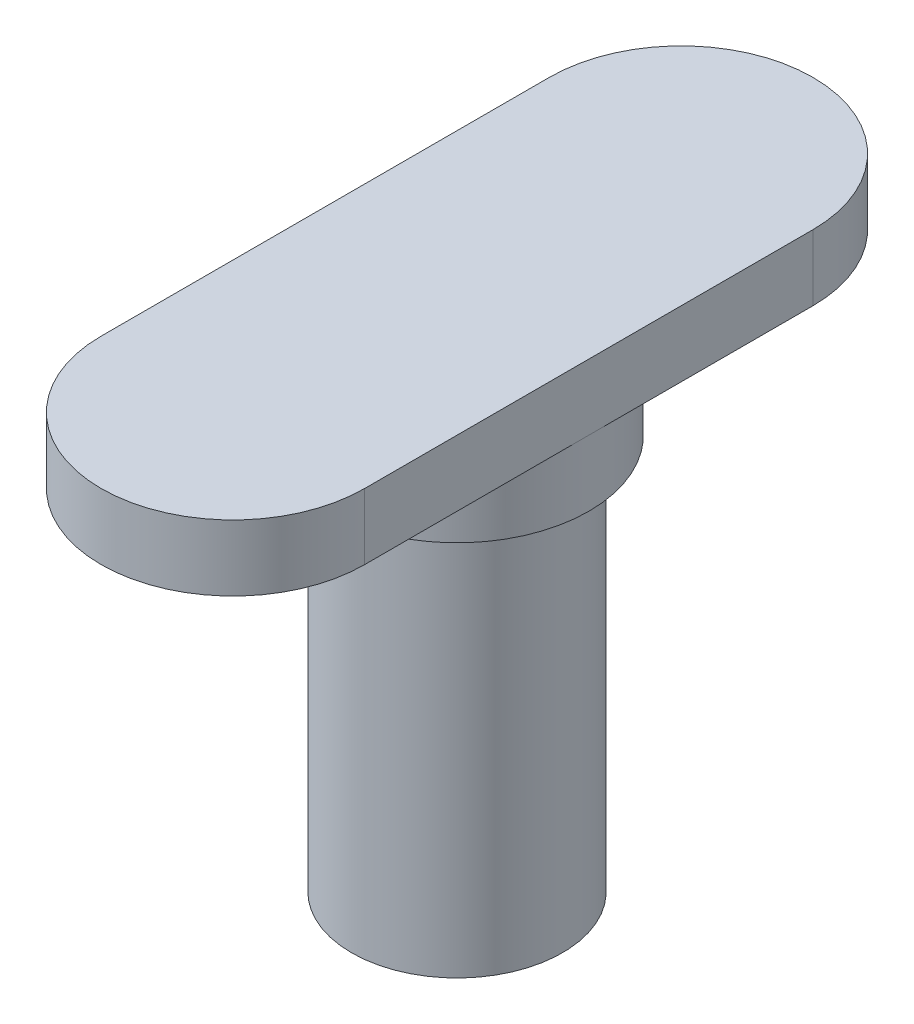
ISO-10303-21;
HEADER;
FILE_DESCRIPTION(('STEP AP214'),'2;1');
FILE_NAME('part.step','',(''),(''),'','','');
FILE_SCHEMA(('AUTOMOTIVE_DESIGN { 1 0 10303 214 1 1 1 1 }'));
ENDSEC;
DATA;
#1=APPLICATION_CONTEXT('core data for automotive mechanical design processes');
#2=APPLICATION_PROTOCOL_DEFINITION('international standard','automotive_design',2000,#1);
#3=PRODUCT_CONTEXT('',#1,'mechanical');
#4=PRODUCT('Part','Part','',(#3));
#5=PRODUCT_RELATED_PRODUCT_CATEGORY('part','',(#4));
#6=PRODUCT_DEFINITION_FORMATION('','',#4);
#7=PRODUCT_DEFINITION_CONTEXT('part definition',#1,'design');
#8=PRODUCT_DEFINITION('design','',#6,#7);
#9=PRODUCT_DEFINITION_SHAPE('','',#8);
#10=(LENGTH_UNIT() NAMED_UNIT(*) SI_UNIT(.MILLI.,.METRE.));
#11=(NAMED_UNIT(*) PLANE_ANGLE_UNIT() SI_UNIT($,.RADIAN.));
#12=(NAMED_UNIT(*) SI_UNIT($,.STERADIAN.) SOLID_ANGLE_UNIT());
#13=UNCERTAINTY_MEASURE_WITH_UNIT(LENGTH_MEASURE(1.E-05),#10,'distance_accuracy_value','');
#14=(GEOMETRIC_REPRESENTATION_CONTEXT(3) GLOBAL_UNCERTAINTY_ASSIGNED_CONTEXT((#13)) GLOBAL_UNIT_ASSIGNED_CONTEXT((#10,
#11,#12)) REPRESENTATION_CONTEXT('',''));
#15=CARTESIAN_POINT('',(0.,0.,0.));
#16=DIRECTION('',(0.,0.,1.));
#17=DIRECTION('',(1.,0.,0.));
#18=AXIS2_PLACEMENT_3D('',#15,#16,#17);
#19=CARTESIAN_POINT('',(0.,20.,0.));
#20=DIRECTION('',(0.,-1.,0.));
#21=DIRECTION('',(0.,0.,-1.));
#22=AXIS2_PLACEMENT_3D('',#19,#20,#21);
#23=CYLINDRICAL_SURFACE('',#22,5.);
#24=CARTESIAN_POINT('',(0.,15.,0.));
#25=DIRECTION('',(0.,1.,0.));
#26=DIRECTION('',(0.,0.,1.));
#27=AXIS2_PLACEMENT_3D('',#24,#25,#26);
#28=CIRCLE('',#27,5.);
#29=CARTESIAN_POINT('',(0.,15.,5.));
#30=VERTEX_POINT('',#29);
#31=EDGE_CURVE('E142',#30,#30,#28,.T.);
#32=ORIENTED_EDGE('',*,*,#31,.T.);
#33=EDGE_LOOP('',(#32));
#34=FACE_BOUND('',#33,.T.);
#35=CARTESIAN_POINT('',(0.,17.5,0.));
#36=DIRECTION('',(0.,1.,0.));
#37=DIRECTION('',(0.,0.,1.));
#38=AXIS2_PLACEMENT_3D('',#35,#36,#37);
#39=CIRCLE('',#38,5.);
#40=CARTESIAN_POINT('',(5.,17.5,0.));
#41=VERTEX_POINT('',#40);
#42=CARTESIAN_POINT('',(-5.,17.5,0.));
#43=VERTEX_POINT('',#42);
#44=EDGE_CURVE('E11',#41,#43,#39,.T.);
#45=ORIENTED_EDGE('',*,*,#44,.F.);
#46=EDGE_CURVE('E47',#43,#41,#39,.T.);
#47=ORIENTED_EDGE('',*,*,#46,.F.);
#48=EDGE_LOOP('',(#45,#47));
#49=FACE_BOUND('',#48,.T.);
#50=ADVANCED_FACE('F37',(#34,#49),#23,.T.);
#51=CARTESIAN_POINT('',(0.,15.,0.));
#52=DIRECTION('',(0.,-1.,0.));
#53=DIRECTION('',(0.,0.,-1.));
#54=AXIS2_PLACEMENT_3D('',#51,#52,#53);
#55=CYLINDRICAL_SURFACE('',#54,4.);
#56=CARTESIAN_POINT('',(-3.70809924354783,5.,-1.5));
#57=CARTESIAN_POINT('',(-3.70809640633806,5.08100748372079,-1.50000304106109));
#58=CARTESIAN_POINT('',(-3.71078260240986,5.16199492250364,-1.49341597549487));
#59=CARTESIAN_POINT('',(-3.72116159304967,5.3215280829132,-1.46736187895468));
#60=CARTESIAN_POINT('',(-3.72885423767112,5.40007387759501,-1.44789523373263));
#61=CARTESIAN_POINT('',(-3.748254802809,5.55237537161353,-1.39689657610574));
#62=CARTESIAN_POINT('',(-3.7599530956926,5.62614205665108,-1.36539347266348));
#63=CARTESIAN_POINT('',(-3.78603134206598,5.76737189681884,-1.29131856742698));
#64=CARTESIAN_POINT('',(-3.80041210067323,5.83483315028252,-1.24874344095039));
#65=CARTESIAN_POINT('',(-3.83103574665713,5.96489031162282,-1.15146661374162));
#66=CARTESIAN_POINT('',(-3.84733341923603,6.02712852962939,-1.09630381213306));
#67=CARTESIAN_POINT('',(-3.87949750628547,6.14172281467149,-0.976395839778925));
#68=CARTESIAN_POINT('',(-3.89536382814785,6.19407677374186,-0.911648630256679));
#69=CARTESIAN_POINT('',(-3.92552873936553,6.28913951229561,-0.7716946551776));
#70=CARTESIAN_POINT('',(-3.93975561223505,6.33145947471586,-0.696206947538027));
#71=CARTESIAN_POINT('',(-3.96438007973847,6.40265117252491,-0.538555771965246));
#72=CARTESIAN_POINT('',(-3.97477900217006,6.43152757199197,-0.456394630933535));
#73=CARTESIAN_POINT('',(-3.99018697103439,6.47375789577462,-0.291489341676831));
#74=CARTESIAN_POINT('',(-3.99540915214774,6.48772762744046,-0.208923197281595));
#75=CARTESIAN_POINT('',(-4.0006401410794,6.50172120094499,-0.0424643637947848));
#76=CARTESIAN_POINT('',(-4.00065064414902,6.50174957761871,0.0414278850628343));
#77=CARTESIAN_POINT('',(-3.99559265903894,6.48821823853483,0.203743543064477));
#78=CARTESIAN_POINT('',(-3.99077541996683,6.47533070205118,0.282232178266901));
#79=CARTESIAN_POINT('',(-3.97693274932263,6.43746408477445,0.435839217984392));
#80=CARTESIAN_POINT('',(-3.96790701975577,6.41248414773796,0.510957383430299));
#81=CARTESIAN_POINT('',(-3.9463776916753,6.35082954832415,0.656989017303105));
#82=CARTESIAN_POINT('',(-3.93382539470077,6.31398999473159,0.72782539228731));
#83=CARTESIAN_POINT('',(-3.90651310225279,6.22980790307061,0.86248660795756));
#84=CARTESIAN_POINT('',(-3.8917523951284,6.1824619769824,0.926309176932324));
#85=CARTESIAN_POINT('',(-3.86052529655816,6.07537271371681,1.04909048680094));
#86=CARTESIAN_POINT('',(-3.84400963763882,6.01506608434957,1.10754614526348));
#87=CARTESIAN_POINT('',(-3.81182460645722,5.88540700667844,1.21370395569343));
#88=CARTESIAN_POINT('',(-3.79615544748847,5.81605229341336,1.261403406929));
#89=CARTESIAN_POINT('',(-3.76712703500335,5.66828053253718,1.34565611808152));
#90=CARTESIAN_POINT('',(-3.75382677150277,5.58969650631393,1.38193847851831));
#91=CARTESIAN_POINT('',(-3.73172438629002,5.42690377483243,1.44056464441501));
#92=CARTESIAN_POINT('',(-3.72291976205783,5.34269822840631,1.46291620605595));
#93=CARTESIAN_POINT('',(-3.71139597222848,5.17602403768405,1.49190191709668));
#94=CARTESIAN_POINT('',(-3.70836785241537,5.09371589446386,1.49933521158966));
#95=CARTESIAN_POINT('',(-3.70786539525016,4.92899064325826,1.50057885636272));
#96=CARTESIAN_POINT('',(-3.71038967003987,4.84657356764753,1.49439261093762));
#97=CARTESIAN_POINT('',(-3.72039381629735,4.68807007771232,1.46929733520157));
#98=CARTESIAN_POINT('',(-3.72763276216449,4.61186886423534,1.45100618334224));
#99=CARTESIAN_POINT('',(-3.74596487046362,4.46365205527981,1.40299774640637));
#100=CARTESIAN_POINT('',(-3.75705882250173,4.39163732083186,1.37327812034623));
#101=CARTESIAN_POINT('',(-3.7823624311608,4.25083556192379,1.30200292275278));
#102=CARTESIAN_POINT('',(-3.79667328892065,4.18227070786266,1.26004545177047));
#103=CARTESIAN_POINT('',(-3.82662814294291,4.05287101827396,1.16591317862479));
#104=CARTESIAN_POINT('',(-3.84227262594077,3.99203902537537,1.11373463696435));
#105=CARTESIAN_POINT('',(-3.87433046553184,3.8758316268049,0.996727340900937));
#106=CARTESIAN_POINT('',(-3.89072969357027,3.82104659123125,0.93130634149106));
#107=CARTESIAN_POINT('',(-3.92149874963302,3.72316163241056,0.791797471753149));
#108=CARTESIAN_POINT('',(-3.93586857107664,3.68006174705416,0.717709573322672));
#109=CARTESIAN_POINT('',(-3.96094985704552,3.60705394380039,0.563016329468476));
#110=CARTESIAN_POINT('',(-3.9716738133801,3.5771008762074,0.482434433064626));
#111=CARTESIAN_POINT('',(-3.98829436712571,3.53134358615008,0.316881887523254));
#112=CARTESIAN_POINT('',(-3.99419323299412,3.5155327145776,0.231913320723592));
#113=CARTESIAN_POINT('',(-4.00028407317073,3.49922559724517,0.0653355852738149));
#114=CARTESIAN_POINT('',(-4.00078860953764,3.49789051694101,-0.0161807680608458));
#115=CARTESIAN_POINT('',(-3.99684889809223,3.50841515944539,-0.178226786412424));
#116=CARTESIAN_POINT('',(-3.9924052471313,3.52027329088586,-0.258756569245258));
#117=CARTESIAN_POINT('',(-3.97921089603771,3.55625885149362,-0.414548248377127));
#118=CARTESIAN_POINT('',(-3.97056791378017,3.58007990587836,-0.489890731068835));
#119=CARTESIAN_POINT('',(-3.9498778362099,3.63901001338436,-0.63551547300639));
#120=CARTESIAN_POINT('',(-3.93783009655664,3.67412120330475,-0.705796771275543));
#121=CARTESIAN_POINT('',(-3.91090618300074,3.75631394350481,-0.842540176994413));
#122=CARTESIAN_POINT('',(-3.89593240108828,3.80383664051415,-0.90871754884685));
#123=CARTESIAN_POINT('',(-3.86499507694844,3.90880783018761,-1.03241734752336));
#124=CARTESIAN_POINT('',(-3.84903118274027,3.96625986580787,-1.0899366712559));
#125=CARTESIAN_POINT('',(-3.81688129739175,4.09306413164506,-1.19781214236196));
#126=CARTESIAN_POINT('',(-3.8007280534916,4.16288440215431,-1.24762999816025));
#127=CARTESIAN_POINT('',(-3.77098325003638,4.31041586957333,-1.33484709556843));
#128=CARTESIAN_POINT('',(-3.75739195631216,4.38812788405348,-1.37224504878157));
#129=CARTESIAN_POINT('',(-3.73402269853266,4.55295568097541,-1.4346588697426));
#130=CARTESIAN_POINT('',(-3.7244380329086,4.64033436651178,-1.45906002899523));
#131=CARTESIAN_POINT('',(-3.71147994336315,4.81848527195579,-1.49172356722079));
#132=CARTESIAN_POINT('',(-3.70810242179736,4.90925521270999,-1.49999659339571));
#133=CARTESIAN_POINT('',(-3.70809924354783,5.,-1.5));
#134=B_SPLINE_CURVE_WITH_KNOTS('',3,(#56,#57,#58,#59,#60,#61,#62,#63,#64,#65,#66,#67,#68,#69,
#70,#71,#72,#73,#74,#75,#76,#77,#78,#79,#80,#81,#82,#83,#84,#85,#86,#87,#88,#89,#90,#91,#92,#93,
#94,#95,#96,#97,#98,#99,#100,#101,#102,#103,#104,#105,#106,#107,#108,#109,#110,#111,#112,#113,
#114,#115,#116,#117,#118,#119,#120,#121,#122,#123,#124,#125,#126,#127,#128,#129,#130,#131,#132,
#133),.UNSPECIFIED.,.T.,.F.,(4,2,2,2,2,2,2,2,2,2,2,2,2,2,2,2,2,2,2,2,2,2,2,2,2,2,2,2,2,2,2,2,2,
2,2,2,2,2,4),(0.,0.24268454141617,0.485361814598855,0.72745985675703,0.969630679682934,
1.22274652401128,1.47591628822983,1.73770072136421,1.9993942638133,2.24980018489679,
2.50012465404857,2.73806472803194,2.97602165263335,3.21744131210668,3.45893893628976,
3.71456675065875,3.97025867827335,4.23162592252966,4.49284751635474,4.73965657740485,
4.98640395388884,5.22143845928199,5.45652113429526,5.70041561005821,5.94439948466355,
6.20385016993624,6.46330169650178,6.72185508890168,6.98028685560127,7.22365720549936,
7.4669982031948,7.7044027400389,7.94185223512831,8.18928323676987,8.43680270894964,
8.69738599542079,8.95799630544242,9.23003178870926,9.50188762323053),.UNSPECIFIED.);
#135=CARTESIAN_POINT('',(-3.70809924354783,5.,-1.5));
#136=VERTEX_POINT('',#135);
#137=EDGE_CURVE('E212',#136,#136,#134,.T.);
#138=ORIENTED_EDGE('',*,*,#137,.T.);
#139=EDGE_LOOP('',(#138));
#140=FACE_BOUND('',#139,.T.);
#141=CARTESIAN_POINT('',(0.,15.,0.));
#142=DIRECTION('',(0.,1.,0.));
#143=DIRECTION('',(0.,0.,1.));
#144=AXIS2_PLACEMENT_3D('',#141,#142,#143);
#145=CIRCLE('',#144,4.);
#146=CARTESIAN_POINT('',(0.,15.,4.));
#147=VERTEX_POINT('',#146);
#148=EDGE_CURVE('E153',#147,#147,#145,.T.);
#149=ORIENTED_EDGE('',*,*,#148,.F.);
#150=EDGE_LOOP('',(#149));
#151=FACE_BOUND('',#150,.T.);
#152=CARTESIAN_POINT('',(0.,0.,0.));
#153=DIRECTION('',(0.,1.,0.));
#154=DIRECTION('',(0.,0.,1.));
#155=AXIS2_PLACEMENT_3D('',#152,#153,#154);
#156=CIRCLE('',#155,4.);
#157=CARTESIAN_POINT('',(0.,0.,4.));
#158=VERTEX_POINT('',#157);
#159=EDGE_CURVE('E152',#158,#158,#156,.T.);
#160=ORIENTED_EDGE('',*,*,#159,.T.);
#161=EDGE_LOOP('',(#160));
#162=FACE_BOUND('',#161,.T.);
#163=ADVANCED_FACE('F39',(#140,#151,#162),#55,.T.);
#164=CARTESIAN_POINT('',(0.,0.,0.));
#165=DIRECTION('',(0.,1.,0.));
#166=DIRECTION('',(0.,0.,1.));
#167=AXIS2_PLACEMENT_3D('',#164,#165,#166);
#168=PLANE('',#167);
#169=DIRECTION('',(0.,0.,1.));
#170=VECTOR('',#169,1.);
#171=CARTESIAN_POINT('',(-1.,0.,0.));
#172=LINE('',#171,#170);
#173=CARTESIAN_POINT('',(-1.,0.,-1.73205080756888));
#174=VERTEX_POINT('',#173);
#175=CARTESIAN_POINT('',(-1.,0.,1.73205080756888));
#176=VERTEX_POINT('',#175);
#177=EDGE_CURVE('E54',#174,#176,#172,.T.);
#178=ORIENTED_EDGE('',*,*,#177,.T.);
#179=CARTESIAN_POINT('',(0.,0.,0.));
#180=DIRECTION('',(0.,1.,0.));
#181=DIRECTION('',(0.,0.,1.));
#182=AXIS2_PLACEMENT_3D('',#179,#180,#181);
#183=CIRCLE('',#182,2.);
#184=EDGE_CURVE('E107',#176,#174,#183,.T.);
#185=ORIENTED_EDGE('',*,*,#184,.T.);
#186=EDGE_LOOP('',(#178,#185));
#187=FACE_BOUND('',#186,.T.);
#188=ORIENTED_EDGE('',*,*,#159,.F.);
#189=EDGE_LOOP('',(#188));
#190=FACE_BOUND('',#189,.T.);
#191=ADVANCED_FACE('F198',(#187,#190),#168,.F.);
#192=CARTESIAN_POINT('',(0.,15.,0.));
#193=DIRECTION('',(0.,1.,0.));
#194=DIRECTION('',(0.,0.,1.));
#195=AXIS2_PLACEMENT_3D('',#192,#193,#194);
#196=PLANE('',#195);
#197=ORIENTED_EDGE('',*,*,#148,.T.);
#198=EDGE_LOOP('',(#197));
#199=FACE_BOUND('',#198,.T.);
#200=ORIENTED_EDGE('',*,*,#31,.F.);
#201=EDGE_LOOP('',(#200));
#202=FACE_BOUND('',#201,.T.);
#203=ADVANCED_FACE('F201',(#199,#202),#196,.F.);
#204=CARTESIAN_POINT('',(0.,17.5,-8.5));
#205=DIRECTION('',(0.,1.,0.));
#206=DIRECTION('',(0.,0.,1.));
#207=AXIS2_PLACEMENT_3D('',#204,#205,#206);
#208=PLANE('',#207);
#209=DIRECTION('',(0.,0.,1.));
#210=VECTOR('',#209,1.);
#211=CARTESIAN_POINT('',(5.,17.5,0.));
#212=LINE('',#211,#210);
#213=CARTESIAN_POINT('',(5.,17.5,-8.5));
#214=VERTEX_POINT('',#213);
#215=EDGE_CURVE('E131',#214,#41,#212,.T.);
#216=ORIENTED_EDGE('',*,*,#215,.T.);
#217=ORIENTED_EDGE('',*,*,#44,.T.);
#218=DIRECTION('',(0.,0.,1.));
#219=VECTOR('',#218,1.);
#220=CARTESIAN_POINT('',(-5.,17.5,0.));
#221=LINE('',#220,#219);
#222=CARTESIAN_POINT('',(-5.,17.5,-8.5));
#223=VERTEX_POINT('',#222);
#224=EDGE_CURVE('E124',#223,#43,#221,.T.);
#225=ORIENTED_EDGE('',*,*,#224,.F.);
#226=CARTESIAN_POINT('',(0.,17.5,-8.5));
#227=DIRECTION('',(0.,1.,0.));
#228=DIRECTION('',(0.,0.,1.));
#229=AXIS2_PLACEMENT_3D('',#226,#227,#228);
#230=CIRCLE('',#229,5.);
#231=EDGE_CURVE('E119',#214,#223,#230,.T.);
#232=ORIENTED_EDGE('',*,*,#231,.F.);
#233=EDGE_LOOP('',(#216,#217,#225,#232));
#234=FACE_BOUND('',#233,.T.);
#235=ADVANCED_FACE('F168',(#234),#208,.F.);
#236=CARTESIAN_POINT('',(5.,17.5,0.));
#237=DIRECTION('',(-1.,0.,0.));
#238=DIRECTION('',(0.,0.,1.));
#239=AXIS2_PLACEMENT_3D('',#236,#237,#238);
#240=PLANE('',#239);
#241=DIRECTION('',(0.,0.,1.));
#242=VECTOR('',#241,1.);
#243=CARTESIAN_POINT('',(5.,20.,0.));
#244=LINE('',#243,#242);
#245=CARTESIAN_POINT('',(5.,20.,-8.5));
#246=VERTEX_POINT('',#245);
#247=CARTESIAN_POINT('',(5.,20.,8.5));
#248=VERTEX_POINT('',#247);
#249=EDGE_CURVE('E123',#246,#248,#244,.T.);
#250=ORIENTED_EDGE('',*,*,#249,.T.);
#251=DIRECTION('',(0.,1.,0.));
#252=VECTOR('',#251,1.);
#253=CARTESIAN_POINT('',(5.,17.5,8.5));
#254=LINE('',#253,#252);
#255=CARTESIAN_POINT('',(5.,17.5,8.5));
#256=VERTEX_POINT('',#255);
#257=EDGE_CURVE('E143',#256,#248,#254,.T.);
#258=ORIENTED_EDGE('',*,*,#257,.F.);
#259=EDGE_CURVE('E130',#41,#256,#212,.T.);
#260=ORIENTED_EDGE('',*,*,#259,.F.);
#261=ORIENTED_EDGE('',*,*,#215,.F.);
#262=DIRECTION('',(0.,1.,0.));
#263=VECTOR('',#262,1.);
#264=CARTESIAN_POINT('',(5.,17.5,-8.5));
#265=LINE('',#264,#263);
#266=EDGE_CURVE('E140',#214,#246,#265,.T.);
#267=ORIENTED_EDGE('',*,*,#266,.T.);
#268=EDGE_LOOP('',(#250,#258,#260,#261,#267));
#269=FACE_BOUND('',#268,.T.);
#270=ADVANCED_FACE('F165',(#269),#240,.F.);
#271=CARTESIAN_POINT('',(-5.,17.5,0.));
#272=DIRECTION('',(-1.,0.,0.));
#273=DIRECTION('',(0.,0.,1.));
#274=AXIS2_PLACEMENT_3D('',#271,#272,#273);
#275=PLANE('',#274);
#276=ORIENTED_EDGE('',*,*,#224,.T.);
#277=CARTESIAN_POINT('',(-5.,17.5,8.49999999999999));
#278=VERTEX_POINT('',#277);
#279=EDGE_CURVE('E122',#43,#278,#221,.T.);
#280=ORIENTED_EDGE('',*,*,#279,.T.);
#281=DIRECTION('',(0.,1.,0.));
#282=VECTOR('',#281,1.);
#283=CARTESIAN_POINT('',(-5.,17.5,8.49999999999999));
#284=LINE('',#283,#282);
#285=CARTESIAN_POINT('',(-5.,20.,8.49999999999999));
#286=VERTEX_POINT('',#285);
#287=EDGE_CURVE('E146',#278,#286,#284,.T.);
#288=ORIENTED_EDGE('',*,*,#287,.T.);
#289=DIRECTION('',(0.,0.,1.));
#290=VECTOR('',#289,1.);
#291=CARTESIAN_POINT('',(-5.,20.,0.));
#292=LINE('',#291,#290);
#293=CARTESIAN_POINT('',(-5.,20.,-8.5));
#294=VERTEX_POINT('',#293);
#295=EDGE_CURVE('E114',#294,#286,#292,.T.);
#296=ORIENTED_EDGE('',*,*,#295,.F.);
#297=DIRECTION('',(0.,1.,0.));
#298=VECTOR('',#297,1.);
#299=CARTESIAN_POINT('',(-5.,17.5,-8.5));
#300=LINE('',#299,#298);
#301=EDGE_CURVE('E133',#223,#294,#300,.T.);
#302=ORIENTED_EDGE('',*,*,#301,.F.);
#303=EDGE_LOOP('',(#276,#280,#288,#296,#302));
#304=FACE_BOUND('',#303,.T.);
#305=ADVANCED_FACE('F182',(#304),#275,.T.);
#306=CARTESIAN_POINT('',(0.,17.5,-8.5));
#307=DIRECTION('',(0.,1.,0.));
#308=DIRECTION('',(0.,0.,1.));
#309=AXIS2_PLACEMENT_3D('',#306,#307,#308);
#310=CYLINDRICAL_SURFACE('',#309,5.);
#311=CARTESIAN_POINT('',(0.,20.,-8.5));
#312=DIRECTION('',(0.,1.,0.));
#313=DIRECTION('',(0.,0.,1.));
#314=AXIS2_PLACEMENT_3D('',#311,#312,#313);
#315=CIRCLE('',#314,5.);
#316=EDGE_CURVE('E111',#246,#294,#315,.T.);
#317=ORIENTED_EDGE('',*,*,#316,.F.);
#318=ORIENTED_EDGE('',*,*,#266,.F.);
#319=ORIENTED_EDGE('',*,*,#231,.T.);
#320=ORIENTED_EDGE('',*,*,#301,.T.);
#321=EDGE_LOOP('',(#317,#318,#319,#320));
#322=FACE_BOUND('',#321,.T.);
#323=ADVANCED_FACE('F172',(#322),#310,.T.);
#324=CARTESIAN_POINT('',(0.,17.5,8.5));
#325=DIRECTION('',(0.,1.,0.));
#326=DIRECTION('',(0.,0.,1.));
#327=AXIS2_PLACEMENT_3D('',#324,#325,#326);
#328=CYLINDRICAL_SURFACE('',#327,5.);
#329=CARTESIAN_POINT('',(0.,20.,8.5));
#330=DIRECTION('',(0.,1.,0.));
#331=DIRECTION('',(0.,0.,1.));
#332=AXIS2_PLACEMENT_3D('',#329,#330,#331);
#333=CIRCLE('',#332,5.);
#334=EDGE_CURVE('E136',#286,#248,#333,.T.);
#335=ORIENTED_EDGE('',*,*,#334,.F.);
#336=ORIENTED_EDGE('',*,*,#287,.F.);
#337=CARTESIAN_POINT('',(0.,17.5,8.5));
#338=DIRECTION('',(0.,1.,0.));
#339=DIRECTION('',(0.,0.,1.));
#340=AXIS2_PLACEMENT_3D('',#337,#338,#339);
#341=CIRCLE('',#340,5.);
#342=EDGE_CURVE('E127',#278,#256,#341,.T.);
#343=ORIENTED_EDGE('',*,*,#342,.T.);
#344=ORIENTED_EDGE('',*,*,#257,.T.);
#345=EDGE_LOOP('',(#335,#336,#343,#344));
#346=FACE_BOUND('',#345,.T.);
#347=ADVANCED_FACE('F180',(#346),#328,.T.);
#348=ORIENTED_EDGE('',*,*,#279,.F.);
#349=ORIENTED_EDGE('',*,*,#46,.T.);
#350=ORIENTED_EDGE('',*,*,#259,.T.);
#351=ORIENTED_EDGE('',*,*,#342,.F.);
#352=EDGE_LOOP('',(#348,#349,#350,#351));
#353=FACE_BOUND('',#352,.T.);
#354=ADVANCED_FACE('F160',(#353),#208,.F.);
#355=CARTESIAN_POINT('',(0.,20.,0.));
#356=DIRECTION('',(0.,1.,0.));
#357=DIRECTION('',(0.,0.,1.));
#358=AXIS2_PLACEMENT_3D('',#355,#356,#357);
#359=PLANE('',#358);
#360=ORIENTED_EDGE('',*,*,#334,.T.);
#361=ORIENTED_EDGE('',*,*,#249,.F.);
#362=ORIENTED_EDGE('',*,*,#316,.T.);
#363=ORIENTED_EDGE('',*,*,#295,.T.);
#364=EDGE_LOOP('',(#360,#361,#362,#363));
#365=FACE_BOUND('',#364,.T.);
#366=ADVANCED_FACE('F176',(#365),#359,.T.);
#367=CARTESIAN_POINT('',(-1.,15.,0.));
#368=DIRECTION('',(1.,0.,0.));
#369=DIRECTION('',(0.,0.,-1.));
#370=AXIS2_PLACEMENT_3D('',#367,#368,#369);
#371=PLANE('',#370);
#372=CARTESIAN_POINT('',(-1.,5.,0.));
#373=DIRECTION('',(1.,0.,0.));
#374=DIRECTION('',(0.,0.,-1.));
#375=AXIS2_PLACEMENT_3D('',#372,#373,#374);
#376=CIRCLE('',#375,1.5);
#377=CARTESIAN_POINT('',(-1.,5.,-1.5));
#378=VERTEX_POINT('',#377);
#379=EDGE_CURVE('E42',#378,#378,#376,.T.);
#380=ORIENTED_EDGE('',*,*,#379,.F.);
#381=EDGE_LOOP('',(#380));
#382=FACE_BOUND('',#381,.T.);
#383=ORIENTED_EDGE('',*,*,#177,.F.);
#384=DIRECTION('',(0.,-1.,0.));
#385=VECTOR('',#384,1.);
#386=CARTESIAN_POINT('',(-1.,15.,-1.73205080756888));
#387=LINE('',#386,#385);
#388=CARTESIAN_POINT('',(-1.,15.,-1.73205080756888));
#389=VERTEX_POINT('',#388);
#390=EDGE_CURVE('E103',#389,#174,#387,.T.);
#391=ORIENTED_EDGE('',*,*,#390,.F.);
#392=DIRECTION('',(0.,0.,1.));
#393=VECTOR('',#392,1.);
#394=CARTESIAN_POINT('',(-1.,15.,0.));
#395=LINE('',#394,#393);
#396=CARTESIAN_POINT('',(-1.,15.,1.73205080756888));
#397=VERTEX_POINT('',#396);
#398=EDGE_CURVE('E100',#389,#397,#395,.T.);
#399=ORIENTED_EDGE('',*,*,#398,.T.);
#400=DIRECTION('',(0.,-1.,0.));
#401=VECTOR('',#400,1.);
#402=CARTESIAN_POINT('',(-1.,15.,1.73205080756888));
#403=LINE('',#402,#401);
#404=EDGE_CURVE('E106',#397,#176,#403,.T.);
#405=ORIENTED_EDGE('',*,*,#404,.T.);
#406=EDGE_LOOP('',(#383,#391,#399,#405));
#407=FACE_BOUND('',#406,.T.);
#408=ADVANCED_FACE('F105',(#382,#407),#371,.T.);
#409=CARTESIAN_POINT('',(0.,15.,0.));
#410=DIRECTION('',(0.,-1.,0.));
#411=DIRECTION('',(0.,0.,-1.));
#412=AXIS2_PLACEMENT_3D('',#409,#410,#411);
#413=CYLINDRICAL_SURFACE('',#412,2.);
#414=ORIENTED_EDGE('',*,*,#184,.F.);
#415=ORIENTED_EDGE('',*,*,#404,.F.);
#416=CARTESIAN_POINT('',(0.,15.,0.));
#417=DIRECTION('',(0.,1.,0.));
#418=DIRECTION('',(0.,0.,1.));
#419=AXIS2_PLACEMENT_3D('',#416,#417,#418);
#420=CIRCLE('',#419,2.);
#421=EDGE_CURVE('E97',#397,#389,#420,.T.);
#422=ORIENTED_EDGE('',*,*,#421,.T.);
#423=ORIENTED_EDGE('',*,*,#390,.T.);
#424=EDGE_LOOP('',(#414,#415,#422,#423));
#425=FACE_BOUND('',#424,.T.);
#426=ADVANCED_FACE('F109',(#425),#413,.F.);
#427=CARTESIAN_POINT('',(0.,15.,0.));
#428=DIRECTION('',(0.,1.,0.));
#429=DIRECTION('',(0.,0.,1.));
#430=AXIS2_PLACEMENT_3D('',#427,#428,#429);
#431=PLANE('',#430);
#432=ORIENTED_EDGE('',*,*,#398,.F.);
#433=ORIENTED_EDGE('',*,*,#421,.F.);
#434=EDGE_LOOP('',(#432,#433));
#435=FACE_BOUND('',#434,.T.);
#436=ADVANCED_FACE('F99',(#435),#431,.F.);
#437=CARTESIAN_POINT('',(-5.,5.,0.));
#438=DIRECTION('',(1.,0.,0.));
#439=DIRECTION('',(0.,0.,-1.));
#440=AXIS2_PLACEMENT_3D('',#437,#438,#439);
#441=CYLINDRICAL_SURFACE('',#440,1.5);
#442=ORIENTED_EDGE('',*,*,#379,.T.);
#443=EDGE_LOOP('',(#442));
#444=FACE_BOUND('',#443,.T.);
#445=ORIENTED_EDGE('',*,*,#137,.F.);
#446=EDGE_LOOP('',(#445));
#447=FACE_BOUND('',#446,.T.);
#448=ADVANCED_FACE('F220',(#444,#447),#441,.F.);
#449=CLOSED_SHELL('',(#50,#163,#191,#203,#235,#270,#305,#323,#347,#354,#366,#408,#426,#436,#448));
#450=MANIFOLD_SOLID_BREP('B2',#449);
#451=ADVANCED_BREP_SHAPE_REPRESENTATION('',(#18,#450),#14);
#452=SHAPE_DEFINITION_REPRESENTATION(#9,#451);
ENDSEC;
END-ISO-10303-21;
